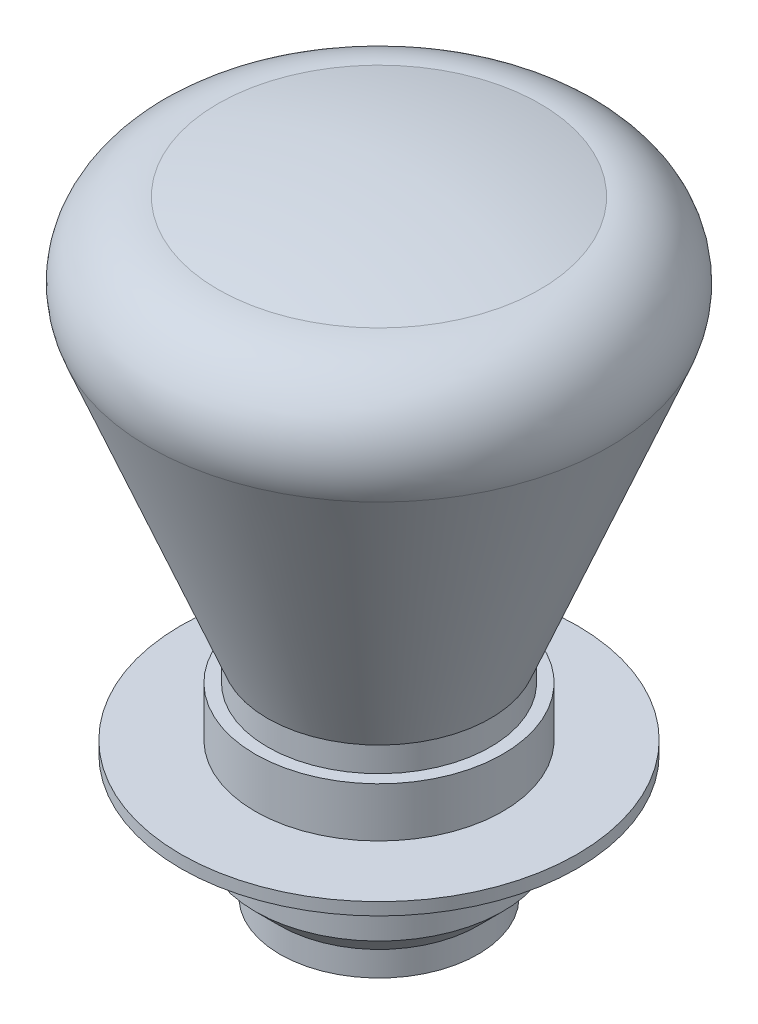
ISO-10303-21;
HEADER;
FILE_DESCRIPTION(('STEP AP214'),'2;1');
FILE_NAME('part.step','',(''),(''),'','','');
FILE_SCHEMA(('AUTOMOTIVE_DESIGN { 1 0 10303 214 1 1 1 1 }'));
ENDSEC;
DATA;
#1=APPLICATION_CONTEXT('core data for automotive mechanical design processes');
#2=APPLICATION_PROTOCOL_DEFINITION('international standard','automotive_design',2000,#1);
#3=PRODUCT_CONTEXT('',#1,'mechanical');
#4=PRODUCT('Part','Part','',(#3));
#5=PRODUCT_RELATED_PRODUCT_CATEGORY('part','',(#4));
#6=PRODUCT_DEFINITION_FORMATION('','',#4);
#7=PRODUCT_DEFINITION_CONTEXT('part definition',#1,'design');
#8=PRODUCT_DEFINITION('design','',#6,#7);
#9=PRODUCT_DEFINITION_SHAPE('','',#8);
#10=(LENGTH_UNIT() NAMED_UNIT(*) SI_UNIT(.MILLI.,.METRE.));
#11=(NAMED_UNIT(*) PLANE_ANGLE_UNIT() SI_UNIT($,.RADIAN.));
#12=(NAMED_UNIT(*) SI_UNIT($,.STERADIAN.) SOLID_ANGLE_UNIT());
#13=UNCERTAINTY_MEASURE_WITH_UNIT(LENGTH_MEASURE(1.E-05),#10,'distance_accuracy_value','');
#14=(GEOMETRIC_REPRESENTATION_CONTEXT(3) GLOBAL_UNCERTAINTY_ASSIGNED_CONTEXT((#13)) GLOBAL_UNIT_ASSIGNED_CONTEXT((#10,
#11,#12)) REPRESENTATION_CONTEXT('',''));
#15=CARTESIAN_POINT('',(0.,0.,0.));
#16=DIRECTION('',(0.,0.,1.));
#17=DIRECTION('',(1.,0.,0.));
#18=AXIS2_PLACEMENT_3D('',#15,#16,#17);
#19=CARTESIAN_POINT('',(0.,-36.0382489005106,0.));
#20=DIRECTION('',(0.,1.,0.));
#21=DIRECTION('',(-1.,0.,0.));
#22=AXIS2_PLACEMENT_3D('',#19,#20,#21);
#23=SPHERICAL_SURFACE('',#22,28.04);
#24=CARTESIAN_POINT('',(0.,-8.76203948644429,0.));
#25=DIRECTION('',(0.,1.,0.));
#26=DIRECTION('',(0.,0.,1.));
#27=AXIS2_PLACEMENT_3D('',#24,#25,#26);
#28=CIRCLE('',#27,6.49999999999998);
#29=CARTESIAN_POINT('',(0.,-8.76203948644429,6.49999999999998));
#30=VERTEX_POINT('',#29);
#31=EDGE_CURVE('E10',#30,#30,#28,.T.);
#32=ORIENTED_EDGE('',*,*,#31,.T.);
#33=EDGE_LOOP('',(#32));
#34=FACE_BOUND('',#33,.T.);
#35=ADVANCED_FACE('F37',(#34),#23,.T.);
#36=CARTESIAN_POINT('',(0.,-11.7620394864443,0.));
#37=DIRECTION('',(0.,1.,0.));
#38=DIRECTION('',(0.,0.,1.));
#39=AXIS2_PLACEMENT_3D('',#36,#37,#38);
#40=TOROIDAL_SURFACE('',#39,6.49999999999998,3.);
#41=CARTESIAN_POINT('',(0.,-12.8824874104281,0.));
#42=DIRECTION('',(0.,1.,0.));
#43=DIRECTION('',(0.,0.,1.));
#44=AXIS2_PLACEMENT_3D('',#41,#42,#43);
#45=CIRCLE('',#44,9.28291150589456);
#46=CARTESIAN_POINT('',(0.,-12.8824874104281,9.28291150589456));
#47=VERTEX_POINT('',#46);
#48=EDGE_CURVE('E43',#47,#47,#45,.T.);
#49=ORIENTED_EDGE('',*,*,#48,.T.);
#50=EDGE_LOOP('',(#49));
#51=FACE_BOUND('',#50,.T.);
#52=ORIENTED_EDGE('',*,*,#31,.F.);
#53=EDGE_LOOP('',(#52));
#54=FACE_BOUND('',#53,.T.);
#55=ADVANCED_FACE('F93',(#51,#54),#40,.T.);
#56=CARTESIAN_POINT('',(0.,-24.7620394864443,0.));
#57=DIRECTION('',(0.,1.,0.));
#58=DIRECTION('',(0.,0.,1.));
#59=AXIS2_PLACEMENT_3D('',#56,#57,#58);
#60=CONICAL_SURFACE('',#59,4.49999999999999,0.382760510475255);
#61=ORIENTED_EDGE('',*,*,#48,.F.);
#62=EDGE_LOOP('',(#61));
#63=FACE_BOUND('',#62,.T.);
#64=CARTESIAN_POINT('',(0.,-24.7620394864443,0.));
#65=DIRECTION('',(0.,1.,0.));
#66=DIRECTION('',(0.,0.,1.));
#67=AXIS2_PLACEMENT_3D('',#64,#65,#66);
#68=CIRCLE('',#67,4.49999999999999);
#69=CARTESIAN_POINT('',(0.,-24.7620394864443,4.49999999999999));
#70=VERTEX_POINT('',#69);
#71=EDGE_CURVE('E47',#70,#70,#68,.T.);
#72=ORIENTED_EDGE('',*,*,#71,.T.);
#73=EDGE_LOOP('',(#72));
#74=FACE_BOUND('',#73,.T.);
#75=ADVANCED_FACE('F97',(#63,#74),#60,.T.);
#76=CARTESIAN_POINT('',(0.,89.3403606102635,0.));
#77=DIRECTION('',(0.,1.,0.));
#78=DIRECTION('',(0.,0.,1.));
#79=AXIS2_PLACEMENT_3D('',#76,#77,#78);
#80=CYLINDRICAL_SURFACE('',#79,4.49999999999999);
#81=ORIENTED_EDGE('',*,*,#71,.F.);
#82=EDGE_LOOP('',(#81));
#83=FACE_BOUND('',#82,.T.);
#84=CARTESIAN_POINT('',(0.,-25.7620394864443,0.));
#85=DIRECTION('',(0.,1.,0.));
#86=DIRECTION('',(0.,0.,1.));
#87=AXIS2_PLACEMENT_3D('',#84,#85,#86);
#88=CIRCLE('',#87,4.49999999999999);
#89=CARTESIAN_POINT('',(0.,-25.7620394864443,4.49999999999999));
#90=VERTEX_POINT('',#89);
#91=EDGE_CURVE('E51',#90,#90,#88,.T.);
#92=ORIENTED_EDGE('',*,*,#91,.T.);
#93=EDGE_LOOP('',(#92));
#94=FACE_BOUND('',#93,.T.);
#95=ADVANCED_FACE('F101',(#83,#94),#80,.T.);
#96=CARTESIAN_POINT('',(-1.78760058744706E-13,-25.7620394864443,0.));
#97=DIRECTION('',(0.,-1.,0.));
#98=DIRECTION('',(0.,0.,-1.));
#99=AXIS2_PLACEMENT_3D('',#96,#97,#98);
#100=PLANE('',#99);
#101=ORIENTED_EDGE('',*,*,#91,.F.);
#102=EDGE_LOOP('',(#101));
#103=FACE_BOUND('',#102,.T.);
#104=CARTESIAN_POINT('',(0.,-25.7620394864443,0.));
#105=DIRECTION('',(0.,1.,0.));
#106=DIRECTION('',(0.,0.,1.));
#107=AXIS2_PLACEMENT_3D('',#104,#105,#106);
#108=CIRCLE('',#107,4.99999999999999);
#109=CARTESIAN_POINT('',(0.,-25.7620394864443,4.99999999999999));
#110=VERTEX_POINT('',#109);
#111=EDGE_CURVE('E56',#110,#110,#108,.T.);
#112=ORIENTED_EDGE('',*,*,#111,.T.);
#113=EDGE_LOOP('',(#112));
#114=FACE_BOUND('',#113,.T.);
#115=ADVANCED_FACE('F108',(#103,#114),#100,.F.);
#116=CARTESIAN_POINT('',(0.,89.3403606102635,0.));
#117=DIRECTION('',(0.,1.,0.));
#118=DIRECTION('',(0.,0.,1.));
#119=AXIS2_PLACEMENT_3D('',#116,#117,#118);
#120=CYLINDRICAL_SURFACE('',#119,4.99999999999999);
#121=ORIENTED_EDGE('',*,*,#111,.F.);
#122=EDGE_LOOP('',(#121));
#123=FACE_BOUND('',#122,.T.);
#124=CARTESIAN_POINT('',(0.,-27.7620394864443,0.));
#125=DIRECTION('',(0.,1.,0.));
#126=DIRECTION('',(0.,0.,1.));
#127=AXIS2_PLACEMENT_3D('',#124,#125,#126);
#128=CIRCLE('',#127,4.99999999999999);
#129=CARTESIAN_POINT('',(0.,-27.7620394864443,4.99999999999999));
#130=VERTEX_POINT('',#129);
#131=EDGE_CURVE('E59',#130,#130,#128,.T.);
#132=ORIENTED_EDGE('',*,*,#131,.T.);
#133=EDGE_LOOP('',(#132));
#134=FACE_BOUND('',#133,.T.);
#135=ADVANCED_FACE('F112',(#123,#134),#120,.T.);
#136=CARTESIAN_POINT('',(0.,-27.7620394864443,0.));
#137=DIRECTION('',(0.,-1.,0.));
#138=DIRECTION('',(0.,0.,-1.));
#139=AXIS2_PLACEMENT_3D('',#136,#137,#138);
#140=PLANE('',#139);
#141=ORIENTED_EDGE('',*,*,#131,.F.);
#142=EDGE_LOOP('',(#141));
#143=FACE_BOUND('',#142,.T.);
#144=CARTESIAN_POINT('',(0.,-27.7620394864443,0.));
#145=DIRECTION('',(0.,1.,0.));
#146=DIRECTION('',(0.,0.,1.));
#147=AXIS2_PLACEMENT_3D('',#144,#145,#146);
#148=CIRCLE('',#147,7.99999999999999);
#149=CARTESIAN_POINT('',(0.,-27.7620394864443,7.99999999999999));
#150=VERTEX_POINT('',#149);
#151=EDGE_CURVE('E62',#150,#150,#148,.T.);
#152=ORIENTED_EDGE('',*,*,#151,.T.);
#153=EDGE_LOOP('',(#152));
#154=FACE_BOUND('',#153,.T.);
#155=ADVANCED_FACE('F116',(#143,#154),#140,.F.);
#156=CARTESIAN_POINT('',(0.,89.3403606102635,0.));
#157=DIRECTION('',(0.,1.,0.));
#158=DIRECTION('',(0.,0.,1.));
#159=AXIS2_PLACEMENT_3D('',#156,#157,#158);
#160=CYLINDRICAL_SURFACE('',#159,7.99999999999999);
#161=ORIENTED_EDGE('',*,*,#151,.F.);
#162=EDGE_LOOP('',(#161));
#163=FACE_BOUND('',#162,.T.);
#164=CARTESIAN_POINT('',(0.,-28.2620394864443,0.));
#165=DIRECTION('',(0.,1.,0.));
#166=DIRECTION('',(0.,0.,1.));
#167=AXIS2_PLACEMENT_3D('',#164,#165,#166);
#168=CIRCLE('',#167,7.99999999999999);
#169=CARTESIAN_POINT('',(0.,-28.2620394864443,7.99999999999999));
#170=VERTEX_POINT('',#169);
#171=EDGE_CURVE('E65',#170,#170,#168,.T.);
#172=ORIENTED_EDGE('',*,*,#171,.T.);
#173=EDGE_LOOP('',(#172));
#174=FACE_BOUND('',#173,.T.);
#175=ADVANCED_FACE('F120',(#163,#174),#160,.T.);
#176=CARTESIAN_POINT('',(0.,-28.2620394864443,0.));
#177=DIRECTION('',(0.,1.,0.));
#178=DIRECTION('',(0.,0.,1.));
#179=AXIS2_PLACEMENT_3D('',#176,#177,#178);
#180=PLANE('',#179);
#181=ORIENTED_EDGE('',*,*,#171,.F.);
#182=EDGE_LOOP('',(#181));
#183=FACE_BOUND('',#182,.T.);
#184=CARTESIAN_POINT('',(0.,-28.2620394864443,0.));
#185=DIRECTION('',(0.,1.,0.));
#186=DIRECTION('',(0.,0.,1.));
#187=AXIS2_PLACEMENT_3D('',#184,#185,#186);
#188=CIRCLE('',#187,4.99999999999999);
#189=CARTESIAN_POINT('',(0.,-28.2620394864443,4.99999999999999));
#190=VERTEX_POINT('',#189);
#191=EDGE_CURVE('E68',#190,#190,#188,.T.);
#192=ORIENTED_EDGE('',*,*,#191,.T.);
#193=EDGE_LOOP('',(#192));
#194=FACE_BOUND('',#193,.T.);
#195=ADVANCED_FACE('F124',(#183,#194),#180,.F.);
#196=CARTESIAN_POINT('',(0.,89.3403606102635,0.));
#197=DIRECTION('',(0.,1.,0.));
#198=DIRECTION('',(0.,0.,1.));
#199=AXIS2_PLACEMENT_3D('',#196,#197,#198);
#200=CYLINDRICAL_SURFACE('',#199,4.99999999999999);
#201=ORIENTED_EDGE('',*,*,#191,.F.);
#202=EDGE_LOOP('',(#201));
#203=FACE_BOUND('',#202,.T.);
#204=CARTESIAN_POINT('',(0.,-31.2620394864443,0.));
#205=DIRECTION('',(0.,1.,0.));
#206=DIRECTION('',(0.,0.,1.));
#207=AXIS2_PLACEMENT_3D('',#204,#205,#206);
#208=CIRCLE('',#207,4.99999999999999);
#209=CARTESIAN_POINT('',(0.,-31.2620394864443,4.99999999999999));
#210=VERTEX_POINT('',#209);
#211=EDGE_CURVE('E71',#210,#210,#208,.T.);
#212=ORIENTED_EDGE('',*,*,#211,.T.);
#213=EDGE_LOOP('',(#212));
#214=FACE_BOUND('',#213,.T.);
#215=ADVANCED_FACE('F128',(#203,#214),#200,.T.);
#216=CARTESIAN_POINT('',(0.,-32.2620394864443,0.));
#217=DIRECTION('',(0.,1.,0.));
#218=DIRECTION('',(0.,0.,1.));
#219=AXIS2_PLACEMENT_3D('',#216,#217,#218);
#220=CONICAL_SURFACE('',#219,3.99999999999999,0.785398163397447);
#221=ORIENTED_EDGE('',*,*,#211,.F.);
#222=EDGE_LOOP('',(#221));
#223=FACE_BOUND('',#222,.T.);
#224=CARTESIAN_POINT('',(0.,-32.2620394864443,0.));
#225=DIRECTION('',(0.,1.,0.));
#226=DIRECTION('',(0.,0.,1.));
#227=AXIS2_PLACEMENT_3D('',#224,#225,#226);
#228=CIRCLE('',#227,3.99999999999999);
#229=CARTESIAN_POINT('',(0.,-32.2620394864443,3.99999999999999));
#230=VERTEX_POINT('',#229);
#231=EDGE_CURVE('E74',#230,#230,#228,.T.);
#232=ORIENTED_EDGE('',*,*,#231,.T.);
#233=EDGE_LOOP('',(#232));
#234=FACE_BOUND('',#233,.T.);
#235=ADVANCED_FACE('F89',(#223,#234),#220,.T.);
#236=CARTESIAN_POINT('',(0.,89.3403606102635,0.));
#237=DIRECTION('',(0.,1.,0.));
#238=DIRECTION('',(0.,0.,1.));
#239=AXIS2_PLACEMENT_3D('',#236,#237,#238);
#240=CYLINDRICAL_SURFACE('',#239,3.99999999999999);
#241=ORIENTED_EDGE('',*,*,#231,.F.);
#242=EDGE_LOOP('',(#241));
#243=FACE_BOUND('',#242,.T.);
#244=CARTESIAN_POINT('',(0.,-33.2620394864443,0.));
#245=DIRECTION('',(0.,1.,0.));
#246=DIRECTION('',(0.,0.,1.));
#247=AXIS2_PLACEMENT_3D('',#244,#245,#246);
#248=CIRCLE('',#247,3.99999999999999);
#249=CARTESIAN_POINT('',(0.,-33.2620394864443,3.99999999999999));
#250=VERTEX_POINT('',#249);
#251=EDGE_CURVE('E77',#250,#250,#248,.T.);
#252=ORIENTED_EDGE('',*,*,#251,.T.);
#253=EDGE_LOOP('',(#252));
#254=FACE_BOUND('',#253,.T.);
#255=ADVANCED_FACE('F81',(#243,#254),#240,.T.);
#256=CARTESIAN_POINT('',(0.,-33.2620394864443,0.));
#257=DIRECTION('',(0.,1.,0.));
#258=DIRECTION('',(0.,0.,1.));
#259=AXIS2_PLACEMENT_3D('',#256,#257,#258);
#260=PLANE('',#259);
#261=ORIENTED_EDGE('',*,*,#251,.F.);
#262=EDGE_LOOP('',(#261));
#263=FACE_BOUND('',#262,.T.);
#264=ADVANCED_FACE('F83',(#263),#260,.F.);
#265=CLOSED_SHELL('',(#35,#55,#75,#95,#115,#135,#155,#175,#195,#215,#235,#255,#264));
#266=MANIFOLD_SOLID_BREP('B2',#265);
#267=ADVANCED_BREP_SHAPE_REPRESENTATION('',(#18,#266),#14);
#268=SHAPE_DEFINITION_REPRESENTATION(#9,#267);
ENDSEC;
END-ISO-10303-21;
